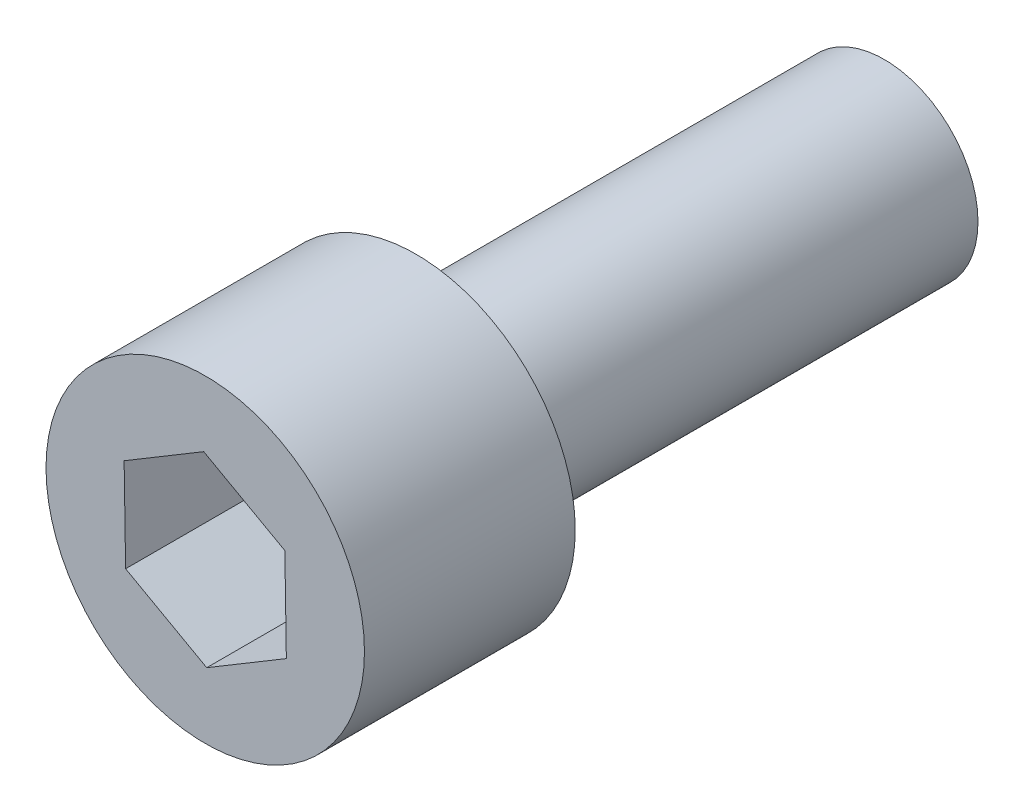
ISO-10303-21;
HEADER;
FILE_DESCRIPTION(('STEP AP214'),'2;1');
FILE_NAME('part.step','',(''),(''),'','','');
FILE_SCHEMA(('AUTOMOTIVE_DESIGN { 1 0 10303 214 1 1 1 1 }'));
ENDSEC;
DATA;
#1=APPLICATION_CONTEXT('core data for automotive mechanical design processes');
#2=APPLICATION_PROTOCOL_DEFINITION('international standard','automotive_design',2000,#1);
#3=PRODUCT_CONTEXT('',#1,'mechanical');
#4=PRODUCT('Part','Part','',(#3));
#5=PRODUCT_RELATED_PRODUCT_CATEGORY('part','',(#4));
#6=PRODUCT_DEFINITION_FORMATION('','',#4);
#7=PRODUCT_DEFINITION_CONTEXT('part definition',#1,'design');
#8=PRODUCT_DEFINITION('design','',#6,#7);
#9=PRODUCT_DEFINITION_SHAPE('','',#8);
#10=(LENGTH_UNIT() NAMED_UNIT(*) SI_UNIT(.MILLI.,.METRE.));
#11=(NAMED_UNIT(*) PLANE_ANGLE_UNIT() SI_UNIT($,.RADIAN.));
#12=(NAMED_UNIT(*) SI_UNIT($,.STERADIAN.) SOLID_ANGLE_UNIT());
#13=UNCERTAINTY_MEASURE_WITH_UNIT(LENGTH_MEASURE(1.E-05),#10,'distance_accuracy_value','');
#14=(GEOMETRIC_REPRESENTATION_CONTEXT(3) GLOBAL_UNCERTAINTY_ASSIGNED_CONTEXT((#13)) GLOBAL_UNIT_ASSIGNED_CONTEXT((#10,
#11,#12)) REPRESENTATION_CONTEXT('',''));
#15=CARTESIAN_POINT('',(0.,0.,0.));
#16=DIRECTION('',(0.,0.,1.));
#17=DIRECTION('',(1.,0.,0.));
#18=AXIS2_PLACEMENT_3D('',#15,#16,#17);
#19=CARTESIAN_POINT('',(0.,0.,10.));
#20=DIRECTION('',(0.,0.,-1.));
#21=DIRECTION('',(-1.,0.,0.));
#22=AXIS2_PLACEMENT_3D('',#19,#20,#21);
#23=CYLINDRICAL_SURFACE('',#22,2.);
#24=CARTESIAN_POINT('',(0.,0.,10.));
#25=DIRECTION('',(0.,0.,1.));
#26=DIRECTION('',(1.,0.,0.));
#27=AXIS2_PLACEMENT_3D('',#24,#25,#26);
#28=CIRCLE('',#27,2.);
#29=CARTESIAN_POINT('',(2.,0.,10.));
#30=VERTEX_POINT('',#29);
#31=EDGE_CURVE('E11',#30,#30,#28,.T.);
#32=ORIENTED_EDGE('',*,*,#31,.F.);
#33=EDGE_LOOP('',(#32));
#34=FACE_BOUND('',#33,.T.);
#35=CARTESIAN_POINT('',(0.,0.,0.));
#36=DIRECTION('',(0.,0.,1.));
#37=DIRECTION('',(1.,0.,0.));
#38=AXIS2_PLACEMENT_3D('',#35,#36,#37);
#39=CIRCLE('',#38,2.);
#40=CARTESIAN_POINT('',(2.,0.,0.));
#41=VERTEX_POINT('',#40);
#42=EDGE_CURVE('E40',#41,#41,#39,.T.);
#43=ORIENTED_EDGE('',*,*,#42,.T.);
#44=EDGE_LOOP('',(#43));
#45=FACE_BOUND('',#44,.T.);
#46=ADVANCED_FACE('F33',(#34,#45),#23,.T.);
#47=CARTESIAN_POINT('',(0.,0.,0.));
#48=DIRECTION('',(0.,0.,1.));
#49=DIRECTION('',(1.,0.,0.));
#50=AXIS2_PLACEMENT_3D('',#47,#48,#49);
#51=PLANE('',#50);
#52=ORIENTED_EDGE('',*,*,#42,.F.);
#53=EDGE_LOOP('',(#52));
#54=FACE_BOUND('',#53,.T.);
#55=ADVANCED_FACE('F138',(#54),#51,.F.);
#56=CARTESIAN_POINT('',(0.,0.,10.));
#57=DIRECTION('',(0.,0.,1.));
#58=DIRECTION('',(1.,0.,0.));
#59=AXIS2_PLACEMENT_3D('',#56,#57,#58);
#60=PLANE('',#59);
#61=CARTESIAN_POINT('',(0.,0.,10.));
#62=DIRECTION('',(0.,0.,1.));
#63=DIRECTION('',(1.,0.,0.));
#64=AXIS2_PLACEMENT_3D('',#61,#62,#63);
#65=CIRCLE('',#64,3.4);
#66=CARTESIAN_POINT('',(3.4,0.,10.));
#67=VERTEX_POINT('',#66);
#68=EDGE_CURVE('E129',#67,#67,#65,.T.);
#69=ORIENTED_EDGE('',*,*,#68,.F.);
#70=EDGE_LOOP('',(#69));
#71=FACE_BOUND('',#70,.T.);
#72=ORIENTED_EDGE('',*,*,#31,.T.);
#73=EDGE_LOOP('',(#72));
#74=FACE_BOUND('',#73,.T.);
#75=ADVANCED_FACE('F140',(#71,#74),#60,.F.);
#76=CARTESIAN_POINT('',(0.,0.,14.5));
#77=DIRECTION('',(0.,0.,1.));
#78=DIRECTION('',(1.,0.,0.));
#79=AXIS2_PLACEMENT_3D('',#76,#77,#78);
#80=PLANE('',#79);
#81=CARTESIAN_POINT('',(0.,0.,14.5));
#82=DIRECTION('',(0.,0.,1.));
#83=DIRECTION('',(1.,0.,0.));
#84=AXIS2_PLACEMENT_3D('',#81,#82,#83);
#85=CIRCLE('',#84,3.4);
#86=CARTESIAN_POINT('',(3.4,0.,14.5));
#87=VERTEX_POINT('',#86);
#88=EDGE_CURVE('E132',#87,#87,#85,.T.);
#89=ORIENTED_EDGE('',*,*,#88,.T.);
#90=EDGE_LOOP('',(#89));
#91=FACE_BOUND('',#90,.T.);
#92=DIRECTION('',(-0.857887544736536,-0.513837484605704,0.));
#93=VECTOR('',#92,1.);
#94=CARTESIAN_POINT('',(-0.0318114607153108,1.98145317896377,14.5));
#95=LINE('',#94,#93);
#96=CARTESIAN_POINT('',(-0.0318114607153108,1.98145317896377,14.5));
#97=VERTEX_POINT('',#96);
#98=CARTESIAN_POINT('',(-1.73189451974971,0.963177056370933,14.5));
#99=VERTEX_POINT('',#98);
#100=EDGE_CURVE('E107',#97,#99,#95,.T.);
#101=ORIENTED_EDGE('',*,*,#100,.F.);
#102=DIRECTION('',(-0.873940087453503,0.486033665029248,0.));
#103=VECTOR('',#102,1.);
#104=CARTESIAN_POINT('',(1.7000830590344,1.01827612259283,14.5));
#105=LINE('',#104,#103);
#106=CARTESIAN_POINT('',(1.7000830590344,1.01827612259283,14.5));
#107=VERTEX_POINT('',#106);
#108=EDGE_CURVE('E105',#107,#97,#105,.T.);
#109=ORIENTED_EDGE('',*,*,#108,.F.);
#110=DIRECTION('',(-0.0160525427169665,0.999871149634952,0.));
#111=VECTOR('',#110,1.);
#112=CARTESIAN_POINT('',(1.73189451974971,-0.963177056370934,14.5));
#113=LINE('',#112,#111);
#114=CARTESIAN_POINT('',(1.73189451974971,-0.963177056370934,14.5));
#115=VERTEX_POINT('',#114);
#116=EDGE_CURVE('E117',#115,#107,#113,.T.);
#117=ORIENTED_EDGE('',*,*,#116,.F.);
#118=DIRECTION('',(0.857887544736537,0.513837484605704,0.));
#119=VECTOR('',#118,1.);
#120=CARTESIAN_POINT('',(0.031811460715311,-1.98145317896377,14.5));
#121=LINE('',#120,#119);
#122=CARTESIAN_POINT('',(0.031811460715311,-1.98145317896377,14.5));
#123=VERTEX_POINT('',#122);
#124=EDGE_CURVE('E96',#123,#115,#121,.T.);
#125=ORIENTED_EDGE('',*,*,#124,.F.);
#126=DIRECTION('',(0.873940087453503,-0.486033665029248,0.));
#127=VECTOR('',#126,1.);
#128=CARTESIAN_POINT('',(-1.7000830590344,-1.01827612259283,14.5));
#129=LINE('',#128,#127);
#130=CARTESIAN_POINT('',(-1.7000830590344,-1.01827612259283,14.5));
#131=VERTEX_POINT('',#130);
#132=EDGE_CURVE('E114',#131,#123,#129,.T.);
#133=ORIENTED_EDGE('',*,*,#132,.F.);
#134=DIRECTION('',(0.0160525427169668,-0.999871149634952,0.));
#135=VECTOR('',#134,1.);
#136=CARTESIAN_POINT('',(-1.73189451974971,0.963177056370933,14.5));
#137=LINE('',#136,#135);
#138=EDGE_CURVE('E112',#99,#131,#137,.T.);
#139=ORIENTED_EDGE('',*,*,#138,.F.);
#140=EDGE_LOOP('',(#101,#109,#117,#125,#133,#139));
#141=FACE_BOUND('',#140,.T.);
#142=ADVANCED_FACE('F146',(#91,#141),#80,.T.);
#143=CARTESIAN_POINT('',(0.,0.,14.5));
#144=DIRECTION('',(0.,0.,-1.));
#145=DIRECTION('',(-1.,0.,0.));
#146=AXIS2_PLACEMENT_3D('',#143,#144,#145);
#147=CYLINDRICAL_SURFACE('',#146,3.4);
#148=ORIENTED_EDGE('',*,*,#88,.F.);
#149=EDGE_LOOP('',(#148));
#150=FACE_BOUND('',#149,.T.);
#151=ORIENTED_EDGE('',*,*,#68,.T.);
#152=EDGE_LOOP('',(#151));
#153=FACE_BOUND('',#152,.T.);
#154=ADVANCED_FACE('F151',(#150,#153),#147,.T.);
#155=CARTESIAN_POINT('',(1.7000830590344,1.01827612259283,14.5));
#156=DIRECTION('',(-0.486033665029248,-0.873940087453503,0.));
#157=DIRECTION('',(0.873940087453503,-0.486033665029248,0.));
#158=AXIS2_PLACEMENT_3D('',#155,#156,#157);
#159=PLANE('',#158);
#160=DIRECTION('',(-0.873940087453503,0.486033665029248,0.));
#161=VECTOR('',#160,1.);
#162=CARTESIAN_POINT('',(1.7000830590344,1.01827612259283,10.));
#163=LINE('',#162,#161);
#164=CARTESIAN_POINT('',(1.7000830590344,1.01827612259283,10.));
#165=VERTEX_POINT('',#164);
#166=CARTESIAN_POINT('',(-0.0318114607153107,1.98145317896377,10.));
#167=VERTEX_POINT('',#166);
#168=EDGE_CURVE('E47',#165,#167,#163,.T.);
#169=ORIENTED_EDGE('',*,*,#168,.F.);
#170=DIRECTION('',(0.,0.,-1.));
#171=VECTOR('',#170,1.);
#172=CARTESIAN_POINT('',(1.7000830590344,1.01827612259283,14.5));
#173=LINE('',#172,#171);
#174=EDGE_CURVE('E100',#107,#165,#173,.T.);
#175=ORIENTED_EDGE('',*,*,#174,.F.);
#176=ORIENTED_EDGE('',*,*,#108,.T.);
#177=DIRECTION('',(0.,0.,-1.));
#178=VECTOR('',#177,1.);
#179=CARTESIAN_POINT('',(-0.0318114607153108,1.98145317896377,14.5));
#180=LINE('',#179,#178);
#181=EDGE_CURVE('E126',#97,#167,#180,.T.);
#182=ORIENTED_EDGE('',*,*,#181,.T.);
#183=EDGE_LOOP('',(#169,#175,#176,#182));
#184=FACE_BOUND('',#183,.T.);
#185=ADVANCED_FACE('F174',(#184),#159,.T.);
#186=CARTESIAN_POINT('',(-0.0318114607153108,1.98145317896377,14.5));
#187=DIRECTION('',(0.513837484605704,-0.857887544736537,0.));
#188=DIRECTION('',(0.857887544736537,0.513837484605704,0.));
#189=AXIS2_PLACEMENT_3D('',#186,#187,#188);
#190=PLANE('',#189);
#191=DIRECTION('',(-0.857887544736536,-0.513837484605704,0.));
#192=VECTOR('',#191,1.);
#193=CARTESIAN_POINT('',(-0.0318114607153108,1.98145317896377,10.));
#194=LINE('',#193,#192);
#195=CARTESIAN_POINT('',(-1.73189451974971,0.963177056370933,10.));
#196=VERTEX_POINT('',#195);
#197=EDGE_CURVE('E51',#167,#196,#194,.T.);
#198=ORIENTED_EDGE('',*,*,#197,.F.);
#199=ORIENTED_EDGE('',*,*,#181,.F.);
#200=ORIENTED_EDGE('',*,*,#100,.T.);
#201=DIRECTION('',(0.,0.,-1.));
#202=VECTOR('',#201,1.);
#203=CARTESIAN_POINT('',(-1.73189451974971,0.963177056370933,14.5));
#204=LINE('',#203,#202);
#205=EDGE_CURVE('E124',#99,#196,#204,.T.);
#206=ORIENTED_EDGE('',*,*,#205,.T.);
#207=EDGE_LOOP('',(#198,#199,#200,#206));
#208=FACE_BOUND('',#207,.T.);
#209=ADVANCED_FACE('F170',(#208),#190,.T.);
#210=CARTESIAN_POINT('',(-1.73189451974971,0.963177056370933,14.5));
#211=DIRECTION('',(0.999871149634952,0.0160525427169668,0.));
#212=DIRECTION('',(-0.0160525427169668,0.999871149634952,0.));
#213=AXIS2_PLACEMENT_3D('',#210,#211,#212);
#214=PLANE('',#213);
#215=DIRECTION('',(0.0160525427169668,-0.999871149634952,0.));
#216=VECTOR('',#215,1.);
#217=CARTESIAN_POINT('',(-1.73189451974971,0.963177056370933,10.));
#218=LINE('',#217,#216);
#219=CARTESIAN_POINT('',(-1.7000830590344,-1.01827612259283,10.));
#220=VERTEX_POINT('',#219);
#221=EDGE_CURVE('E194',#196,#220,#218,.T.);
#222=ORIENTED_EDGE('',*,*,#221,.F.);
#223=ORIENTED_EDGE('',*,*,#205,.F.);
#224=ORIENTED_EDGE('',*,*,#138,.T.);
#225=DIRECTION('',(0.,0.,-1.));
#226=VECTOR('',#225,1.);
#227=CARTESIAN_POINT('',(-1.7000830590344,-1.01827612259283,14.5));
#228=LINE('',#227,#226);
#229=EDGE_CURVE('E121',#131,#220,#228,.T.);
#230=ORIENTED_EDGE('',*,*,#229,.T.);
#231=EDGE_LOOP('',(#222,#223,#224,#230));
#232=FACE_BOUND('',#231,.T.);
#233=ADVANCED_FACE('F166',(#232),#214,.T.);
#234=CARTESIAN_POINT('',(-1.7000830590344,-1.01827612259283,14.5));
#235=DIRECTION('',(0.486033665029248,0.873940087453503,0.));
#236=DIRECTION('',(-0.873940087453503,0.486033665029248,0.));
#237=AXIS2_PLACEMENT_3D('',#234,#235,#236);
#238=PLANE('',#237);
#239=DIRECTION('',(0.873940087453503,-0.486033665029248,0.));
#240=VECTOR('',#239,1.);
#241=CARTESIAN_POINT('',(-1.7000830590344,-1.01827612259283,10.));
#242=LINE('',#241,#240);
#243=CARTESIAN_POINT('',(0.0318114607153109,-1.98145317896377,10.));
#244=VERTEX_POINT('',#243);
#245=EDGE_CURVE('E87',#220,#244,#242,.T.);
#246=ORIENTED_EDGE('',*,*,#245,.F.);
#247=ORIENTED_EDGE('',*,*,#229,.F.);
#248=ORIENTED_EDGE('',*,*,#132,.T.);
#249=DIRECTION('',(0.,0.,-1.));
#250=VECTOR('',#249,1.);
#251=CARTESIAN_POINT('',(0.031811460715311,-1.98145317896377,14.5));
#252=LINE('',#251,#250);
#253=EDGE_CURVE('E99',#123,#244,#252,.T.);
#254=ORIENTED_EDGE('',*,*,#253,.T.);
#255=EDGE_LOOP('',(#246,#247,#248,#254));
#256=FACE_BOUND('',#255,.T.);
#257=ADVANCED_FACE('F161',(#256),#238,.T.);
#258=CARTESIAN_POINT('',(0.031811460715311,-1.98145317896377,14.5));
#259=DIRECTION('',(-0.513837484605704,0.857887544736537,0.));
#260=DIRECTION('',(-0.857887544736537,-0.513837484605704,0.));
#261=AXIS2_PLACEMENT_3D('',#258,#259,#260);
#262=PLANE('',#261);
#263=DIRECTION('',(0.857887544736537,0.513837484605704,0.));
#264=VECTOR('',#263,1.);
#265=CARTESIAN_POINT('',(0.031811460715311,-1.98145317896377,10.));
#266=LINE('',#265,#264);
#267=CARTESIAN_POINT('',(1.73189451974971,-0.963177056370934,10.));
#268=VERTEX_POINT('',#267);
#269=EDGE_CURVE('E81',#244,#268,#266,.T.);
#270=ORIENTED_EDGE('',*,*,#269,.F.);
#271=ORIENTED_EDGE('',*,*,#253,.F.);
#272=ORIENTED_EDGE('',*,*,#124,.T.);
#273=DIRECTION('',(0.,0.,-1.));
#274=VECTOR('',#273,1.);
#275=CARTESIAN_POINT('',(1.73189451974971,-0.963177056370934,14.5));
#276=LINE('',#275,#274);
#277=EDGE_CURVE('E93',#115,#268,#276,.T.);
#278=ORIENTED_EDGE('',*,*,#277,.T.);
#279=EDGE_LOOP('',(#270,#271,#272,#278));
#280=FACE_BOUND('',#279,.T.);
#281=ADVANCED_FACE('F94',(#280),#262,.T.);
#282=CARTESIAN_POINT('',(1.73189451974971,-0.963177056370934,14.5));
#283=DIRECTION('',(-0.999871149634952,-0.0160525427169665,0.));
#284=DIRECTION('',(0.0160525427169665,-0.999871149634952,0.));
#285=AXIS2_PLACEMENT_3D('',#282,#283,#284);
#286=PLANE('',#285);
#287=DIRECTION('',(-0.0160525427169665,0.999871149634952,0.));
#288=VECTOR('',#287,1.);
#289=CARTESIAN_POINT('',(1.73189451974971,-0.963177056370934,10.));
#290=LINE('',#289,#288);
#291=EDGE_CURVE('E85',#268,#165,#290,.T.);
#292=ORIENTED_EDGE('',*,*,#291,.F.);
#293=ORIENTED_EDGE('',*,*,#277,.F.);
#294=ORIENTED_EDGE('',*,*,#116,.T.);
#295=ORIENTED_EDGE('',*,*,#174,.T.);
#296=EDGE_LOOP('',(#292,#293,#294,#295));
#297=FACE_BOUND('',#296,.T.);
#298=ADVANCED_FACE('F103',(#297),#286,.T.);
#299=CARTESIAN_POINT('',(0.,0.,10.));
#300=DIRECTION('',(0.,0.,1.));
#301=DIRECTION('',(1.,0.,0.));
#302=AXIS2_PLACEMENT_3D('',#299,#300,#301);
#303=PLANE('',#302);
#304=ORIENTED_EDGE('',*,*,#168,.T.);
#305=ORIENTED_EDGE('',*,*,#197,.T.);
#306=ORIENTED_EDGE('',*,*,#221,.T.);
#307=ORIENTED_EDGE('',*,*,#245,.T.);
#308=ORIENTED_EDGE('',*,*,#269,.T.);
#309=ORIENTED_EDGE('',*,*,#291,.T.);
#310=EDGE_LOOP('',(#304,#305,#306,#307,#308,#309));
#311=FACE_BOUND('',#310,.T.);
#312=ADVANCED_FACE('F83',(#311),#303,.T.);
#313=CLOSED_SHELL('',(#46,#55,#75,#142,#154,#185,#209,#233,#257,#281,#298,#312));
#314=MANIFOLD_SOLID_BREP('B2',#313);
#315=ADVANCED_BREP_SHAPE_REPRESENTATION('',(#18,#314),#14);
#316=SHAPE_DEFINITION_REPRESENTATION(#9,#315);
ENDSEC;
END-ISO-10303-21;
